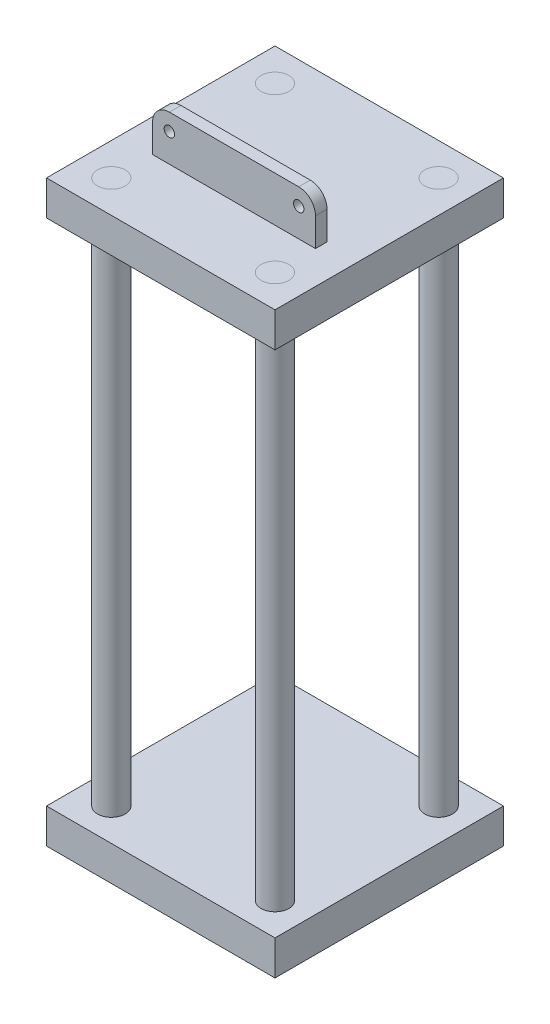
ISO-10303-21;
HEADER;
FILE_DESCRIPTION(('STEP AP214'),'2;1');
FILE_NAME('part.step','',(''),(''),'','','');
FILE_SCHEMA(('AUTOMOTIVE_DESIGN { 1 0 10303 214 1 1 1 1 }'));
ENDSEC;
DATA;
#1=APPLICATION_CONTEXT('core data for automotive mechanical design processes');
#2=APPLICATION_PROTOCOL_DEFINITION('international standard','automotive_design',2000,#1);
#3=PRODUCT_CONTEXT('',#1,'mechanical');
#4=PRODUCT('Part','Part','',(#3));
#5=PRODUCT_RELATED_PRODUCT_CATEGORY('part','',(#4));
#6=PRODUCT_DEFINITION_FORMATION('','',#4);
#7=PRODUCT_DEFINITION_CONTEXT('part definition',#1,'design');
#8=PRODUCT_DEFINITION('design','',#6,#7);
#9=PRODUCT_DEFINITION_SHAPE('','',#8);
#10=(LENGTH_UNIT() NAMED_UNIT(*) SI_UNIT(.MILLI.,.METRE.));
#11=(NAMED_UNIT(*) PLANE_ANGLE_UNIT() SI_UNIT($,.RADIAN.));
#12=(NAMED_UNIT(*) SI_UNIT($,.STERADIAN.) SOLID_ANGLE_UNIT());
#13=UNCERTAINTY_MEASURE_WITH_UNIT(LENGTH_MEASURE(1.E-05),#10,'distance_accuracy_value','');
#14=(GEOMETRIC_REPRESENTATION_CONTEXT(3) GLOBAL_UNCERTAINTY_ASSIGNED_CONTEXT((#13)) GLOBAL_UNIT_ASSIGNED_CONTEXT((#10,
#11,#12)) REPRESENTATION_CONTEXT('',''));
#15=CARTESIAN_POINT('',(0.,0.,0.));
#16=DIRECTION('',(0.,0.,1.));
#17=DIRECTION('',(1.,0.,0.));
#18=AXIS2_PLACEMENT_3D('',#15,#16,#17);
#19=CARTESIAN_POINT('',(27.94,262.25,17.7));
#20=DIRECTION('',(0.,0.,-1.));
#21=DIRECTION('',(-1.,0.,0.));
#22=AXIS2_PLACEMENT_3D('',#19,#20,#21);
#23=CYLINDRICAL_SURFACE('',#22,7.24999999999995);
#24=CARTESIAN_POINT('',(27.94,262.25,12.7));
#25=DIRECTION('',(0.,0.,1.));
#26=DIRECTION('',(1.,0.,0.));
#27=AXIS2_PLACEMENT_3D('',#24,#25,#26);
#28=CIRCLE('',#27,7.24999999999995);
#29=CARTESIAN_POINT('',(27.94,269.5,12.7));
#30=VERTEX_POINT('',#29);
#31=CARTESIAN_POINT('',(35.19,262.25,12.7));
#32=VERTEX_POINT('',#31);
#33=EDGE_CURVE('E141',#30,#32,#28,.F.);
#34=ORIENTED_EDGE('',*,*,#33,.F.);
#35=DIRECTION('',(0.,0.,-1.));
#36=VECTOR('',#35,1.);
#37=CARTESIAN_POINT('',(27.94,269.5,17.7));
#38=LINE('',#37,#36);
#39=CARTESIAN_POINT('',(27.94,269.5,17.7));
#40=VERTEX_POINT('',#39);
#41=EDGE_CURVE('E12',#40,#30,#38,.T.);
#42=ORIENTED_EDGE('',*,*,#41,.F.);
#43=CARTESIAN_POINT('',(27.94,262.25,17.7));
#44=DIRECTION('',(0.,0.,1.));
#45=DIRECTION('',(1.,0.,0.));
#46=AXIS2_PLACEMENT_3D('',#43,#44,#45);
#47=CIRCLE('',#46,7.24999999999995);
#48=CARTESIAN_POINT('',(35.19,262.25,17.7));
#49=VERTEX_POINT('',#48);
#50=EDGE_CURVE('E160',#40,#49,#47,.F.);
#51=ORIENTED_EDGE('',*,*,#50,.T.);
#52=DIRECTION('',(0.,0.,-1.));
#53=VECTOR('',#52,1.);
#54=CARTESIAN_POINT('',(35.19,262.25,17.7));
#55=LINE('',#54,#53);
#56=EDGE_CURVE('E96',#49,#32,#55,.T.);
#57=ORIENTED_EDGE('',*,*,#56,.T.);
#58=EDGE_LOOP('',(#34,#42,#51,#57));
#59=FACE_BOUND('',#58,.T.);
#60=ADVANCED_FACE('F52',(#59),#23,.T.);
#61=CARTESIAN_POINT('',(0.,269.5,17.7));
#62=DIRECTION('',(0.,1.,0.));
#63=DIRECTION('',(0.,0.,1.));
#64=AXIS2_PLACEMENT_3D('',#61,#62,#63);
#65=PLANE('',#64);
#66=DIRECTION('',(1.,0.,0.));
#67=VECTOR('',#66,1.);
#68=CARTESIAN_POINT('',(0.,269.5,12.7));
#69=LINE('',#68,#67);
#70=CARTESIAN_POINT('',(-27.94,269.5,12.7));
#71=VERTEX_POINT('',#70);
#72=EDGE_CURVE('E144',#71,#30,#69,.T.);
#73=ORIENTED_EDGE('',*,*,#72,.F.);
#74=DIRECTION('',(0.,0.,-1.));
#75=VECTOR('',#74,1.);
#76=CARTESIAN_POINT('',(-27.94,269.5,17.7));
#77=LINE('',#76,#75);
#78=CARTESIAN_POINT('',(-27.94,269.5,17.7));
#79=VERTEX_POINT('',#78);
#80=EDGE_CURVE('E60',#79,#71,#77,.T.);
#81=ORIENTED_EDGE('',*,*,#80,.F.);
#82=DIRECTION('',(1.,0.,0.));
#83=VECTOR('',#82,1.);
#84=CARTESIAN_POINT('',(0.,269.5,17.7));
#85=LINE('',#84,#83);
#86=EDGE_CURVE('E130',#79,#40,#85,.T.);
#87=ORIENTED_EDGE('',*,*,#86,.T.);
#88=ORIENTED_EDGE('',*,*,#41,.T.);
#89=EDGE_LOOP('',(#73,#81,#87,#88));
#90=FACE_BOUND('',#89,.T.);
#91=ADVANCED_FACE('F169',(#90),#65,.T.);
#92=CARTESIAN_POINT('',(-27.94,262.25,17.7));
#93=DIRECTION('',(0.,0.,-1.));
#94=DIRECTION('',(-1.,0.,0.));
#95=AXIS2_PLACEMENT_3D('',#92,#93,#94);
#96=CYLINDRICAL_SURFACE('',#95,7.24999999999999);
#97=CARTESIAN_POINT('',(-27.94,262.25,12.7));
#98=DIRECTION('',(0.,0.,1.));
#99=DIRECTION('',(1.,0.,0.));
#100=AXIS2_PLACEMENT_3D('',#97,#98,#99);
#101=CIRCLE('',#100,7.24999999999999);
#102=CARTESIAN_POINT('',(-35.19,262.25,12.7));
#103=VERTEX_POINT('',#102);
#104=EDGE_CURVE('E147',#103,#71,#101,.F.);
#105=ORIENTED_EDGE('',*,*,#104,.F.);
#106=DIRECTION('',(0.,0.,-1.));
#107=VECTOR('',#106,1.);
#108=CARTESIAN_POINT('',(-35.19,262.25,17.7));
#109=LINE('',#108,#107);
#110=CARTESIAN_POINT('',(-35.19,262.25,17.7));
#111=VERTEX_POINT('',#110);
#112=EDGE_CURVE('E117',#111,#103,#109,.T.);
#113=ORIENTED_EDGE('',*,*,#112,.F.);
#114=CARTESIAN_POINT('',(-27.94,262.25,17.7));
#115=DIRECTION('',(0.,0.,1.));
#116=DIRECTION('',(1.,0.,0.));
#117=AXIS2_PLACEMENT_3D('',#114,#115,#116);
#118=CIRCLE('',#117,7.24999999999999);
#119=EDGE_CURVE('E128',#111,#79,#118,.F.);
#120=ORIENTED_EDGE('',*,*,#119,.T.);
#121=ORIENTED_EDGE('',*,*,#80,.T.);
#122=EDGE_LOOP('',(#105,#113,#120,#121));
#123=FACE_BOUND('',#122,.T.);
#124=ADVANCED_FACE('F166',(#123),#96,.T.);
#125=CARTESIAN_POINT('',(-35.1900000000007,0.,17.7));
#126=DIRECTION('',(-1.,0.,0.));
#127=DIRECTION('',(0.,-1.,0.));
#128=AXIS2_PLACEMENT_3D('',#125,#126,#127);
#129=PLANE('',#128);
#130=DIRECTION('',(0.,1.,0.));
#131=VECTOR('',#130,1.);
#132=CARTESIAN_POINT('',(-35.1900000000007,0.,12.7));
#133=LINE('',#132,#131);
#134=CARTESIAN_POINT('',(-35.19,250.,12.7));
#135=VERTEX_POINT('',#134);
#136=EDGE_CURVE('E116',#135,#103,#133,.T.);
#137=ORIENTED_EDGE('',*,*,#136,.F.);
#138=DIRECTION('',(0.,0.,-1.));
#139=VECTOR('',#138,1.);
#140=CARTESIAN_POINT('',(-35.19,250.,17.7));
#141=LINE('',#140,#139);
#142=CARTESIAN_POINT('',(-35.19,250.,17.7));
#143=VERTEX_POINT('',#142);
#144=EDGE_CURVE('E110',#143,#135,#141,.T.);
#145=ORIENTED_EDGE('',*,*,#144,.F.);
#146=DIRECTION('',(0.,1.,0.));
#147=VECTOR('',#146,1.);
#148=CARTESIAN_POINT('',(-35.1900000000007,0.,17.7));
#149=LINE('',#148,#147);
#150=EDGE_CURVE('E114',#143,#111,#149,.T.);
#151=ORIENTED_EDGE('',*,*,#150,.T.);
#152=ORIENTED_EDGE('',*,*,#112,.T.);
#153=EDGE_LOOP('',(#137,#145,#151,#152));
#154=FACE_BOUND('',#153,.T.);
#155=ADVANCED_FACE('F112',(#154),#129,.T.);
#156=CARTESIAN_POINT('',(0.,250.,17.7));
#157=DIRECTION('',(0.,1.,0.));
#158=DIRECTION('',(0.,0.,1.));
#159=AXIS2_PLACEMENT_3D('',#156,#157,#158);
#160=PLANE('',#159);
#161=DIRECTION('',(1.,0.,0.));
#162=VECTOR('',#161,1.);
#163=CARTESIAN_POINT('',(0.,250.,12.7));
#164=LINE('',#163,#162);
#165=CARTESIAN_POINT('',(35.19,250.,12.7));
#166=VERTEX_POINT('',#165);
#167=EDGE_CURVE('E89',#135,#166,#164,.T.);
#168=ORIENTED_EDGE('',*,*,#167,.T.);
#169=DIRECTION('',(0.,0.,-1.));
#170=VECTOR('',#169,1.);
#171=CARTESIAN_POINT('',(35.19,250.,17.7));
#172=LINE('',#171,#170);
#173=CARTESIAN_POINT('',(35.19,250.,17.7));
#174=VERTEX_POINT('',#173);
#175=EDGE_CURVE('E118',#174,#166,#172,.T.);
#176=ORIENTED_EDGE('',*,*,#175,.F.);
#177=DIRECTION('',(1.,0.,0.));
#178=VECTOR('',#177,1.);
#179=CARTESIAN_POINT('',(0.,250.,17.7));
#180=LINE('',#179,#178);
#181=EDGE_CURVE('E120',#143,#174,#180,.T.);
#182=ORIENTED_EDGE('',*,*,#181,.F.);
#183=ORIENTED_EDGE('',*,*,#144,.T.);
#184=EDGE_LOOP('',(#168,#176,#182,#183));
#185=FACE_BOUND('',#184,.T.);
#186=ADVANCED_FACE('F121',(#185),#160,.F.);
#187=CARTESIAN_POINT('',(27.94,262.25,17.7));
#188=DIRECTION('',(0.,0.,-1.));
#189=DIRECTION('',(-1.,0.,0.));
#190=AXIS2_PLACEMENT_3D('',#187,#188,#189);
#191=CYLINDRICAL_SURFACE('',#190,2.25);
#192=CARTESIAN_POINT('',(27.94,262.25,17.7));
#193=DIRECTION('',(0.,0.,1.));
#194=DIRECTION('',(1.,0.,0.));
#195=AXIS2_PLACEMENT_3D('',#192,#193,#194);
#196=CIRCLE('',#195,2.25);
#197=CARTESIAN_POINT('',(30.19,262.25,17.7));
#198=VERTEX_POINT('',#197);
#199=EDGE_CURVE('E135',#198,#198,#196,.T.);
#200=ORIENTED_EDGE('',*,*,#199,.T.);
#201=EDGE_LOOP('',(#200));
#202=FACE_BOUND('',#201,.T.);
#203=CARTESIAN_POINT('',(27.94,262.25,12.7));
#204=DIRECTION('',(0.,0.,1.));
#205=DIRECTION('',(1.,0.,0.));
#206=AXIS2_PLACEMENT_3D('',#203,#204,#205);
#207=CIRCLE('',#206,2.25);
#208=CARTESIAN_POINT('',(30.19,262.25,12.7));
#209=VERTEX_POINT('',#208);
#210=EDGE_CURVE('E154',#209,#209,#207,.T.);
#211=ORIENTED_EDGE('',*,*,#210,.F.);
#212=EDGE_LOOP('',(#211));
#213=FACE_BOUND('',#212,.T.);
#214=ADVANCED_FACE('F190',(#202,#213),#191,.F.);
#215=CARTESIAN_POINT('',(35.1900000000007,0.,17.7));
#216=DIRECTION('',(-1.,0.,0.));
#217=DIRECTION('',(0.,-1.,0.));
#218=AXIS2_PLACEMENT_3D('',#215,#216,#217);
#219=PLANE('',#218);
#220=DIRECTION('',(0.,1.,0.));
#221=VECTOR('',#220,1.);
#222=CARTESIAN_POINT('',(35.1900000000007,0.,12.7));
#223=LINE('',#222,#221);
#224=EDGE_CURVE('E152',#166,#32,#223,.T.);
#225=ORIENTED_EDGE('',*,*,#224,.T.);
#226=ORIENTED_EDGE('',*,*,#56,.F.);
#227=DIRECTION('',(0.,1.,0.));
#228=VECTOR('',#227,1.);
#229=CARTESIAN_POINT('',(35.1900000000007,0.,17.7));
#230=LINE('',#229,#228);
#231=EDGE_CURVE('E68',#174,#49,#230,.T.);
#232=ORIENTED_EDGE('',*,*,#231,.F.);
#233=ORIENTED_EDGE('',*,*,#175,.T.);
#234=EDGE_LOOP('',(#225,#226,#232,#233));
#235=FACE_BOUND('',#234,.T.);
#236=ADVANCED_FACE('F175',(#235),#219,.F.);
#237=CARTESIAN_POINT('',(-27.94,262.25,17.7));
#238=DIRECTION('',(0.,0.,-1.));
#239=DIRECTION('',(-1.,0.,0.));
#240=AXIS2_PLACEMENT_3D('',#237,#238,#239);
#241=CYLINDRICAL_SURFACE('',#240,2.24999999999999);
#242=CARTESIAN_POINT('',(-27.94,262.25,17.7));
#243=DIRECTION('',(0.,0.,1.));
#244=DIRECTION('',(1.,0.,0.));
#245=AXIS2_PLACEMENT_3D('',#242,#243,#244);
#246=CIRCLE('',#245,2.24999999999999);
#247=CARTESIAN_POINT('',(-25.69,262.25,17.7));
#248=VERTEX_POINT('',#247);
#249=EDGE_CURVE('E138',#248,#248,#246,.T.);
#250=ORIENTED_EDGE('',*,*,#249,.T.);
#251=EDGE_LOOP('',(#250));
#252=FACE_BOUND('',#251,.T.);
#253=CARTESIAN_POINT('',(-27.94,262.25,12.7));
#254=DIRECTION('',(0.,0.,1.));
#255=DIRECTION('',(1.,0.,0.));
#256=AXIS2_PLACEMENT_3D('',#253,#254,#255);
#257=CIRCLE('',#256,2.24999999999999);
#258=CARTESIAN_POINT('',(-25.69,262.25,12.7));
#259=VERTEX_POINT('',#258);
#260=EDGE_CURVE('E157',#259,#259,#257,.T.);
#261=ORIENTED_EDGE('',*,*,#260,.F.);
#262=EDGE_LOOP('',(#261));
#263=FACE_BOUND('',#262,.T.);
#264=ADVANCED_FACE('F193',(#252,#263),#241,.F.);
#265=CARTESIAN_POINT('',(0.,0.,17.7));
#266=DIRECTION('',(0.,0.,1.));
#267=DIRECTION('',(1.,0.,0.));
#268=AXIS2_PLACEMENT_3D('',#265,#266,#267);
#269=PLANE('',#268);
#270=ORIENTED_EDGE('',*,*,#50,.F.);
#271=ORIENTED_EDGE('',*,*,#86,.F.);
#272=ORIENTED_EDGE('',*,*,#119,.F.);
#273=ORIENTED_EDGE('',*,*,#150,.F.);
#274=ORIENTED_EDGE('',*,*,#181,.T.);
#275=ORIENTED_EDGE('',*,*,#231,.T.);
#276=EDGE_LOOP('',(#270,#271,#272,#273,#274,#275));
#277=FACE_BOUND('',#276,.T.);
#278=ORIENTED_EDGE('',*,*,#199,.F.);
#279=EDGE_LOOP('',(#278));
#280=FACE_BOUND('',#279,.T.);
#281=ORIENTED_EDGE('',*,*,#249,.F.);
#282=EDGE_LOOP('',(#281));
#283=FACE_BOUND('',#282,.T.);
#284=ADVANCED_FACE('F124',(#277,#280,#283),#269,.T.);
#285=CARTESIAN_POINT('',(0.,0.,12.7));
#286=DIRECTION('',(0.,0.,1.));
#287=DIRECTION('',(1.,0.,0.));
#288=AXIS2_PLACEMENT_3D('',#285,#286,#287);
#289=PLANE('',#288);
#290=ORIENTED_EDGE('',*,*,#33,.T.);
#291=ORIENTED_EDGE('',*,*,#224,.F.);
#292=ORIENTED_EDGE('',*,*,#167,.F.);
#293=ORIENTED_EDGE('',*,*,#136,.T.);
#294=ORIENTED_EDGE('',*,*,#104,.T.);
#295=ORIENTED_EDGE('',*,*,#72,.T.);
#296=EDGE_LOOP('',(#290,#291,#292,#293,#294,#295));
#297=FACE_BOUND('',#296,.T.);
#298=ORIENTED_EDGE('',*,*,#210,.T.);
#299=EDGE_LOOP('',(#298));
#300=FACE_BOUND('',#299,.T.);
#301=ORIENTED_EDGE('',*,*,#260,.T.);
#302=EDGE_LOOP('',(#301));
#303=FACE_BOUND('',#302,.T.);
#304=ADVANCED_FACE('F171',(#297,#300,#303),#289,.F.);
#305=CLOSED_SHELL('',(#60,#91,#124,#155,#186,#214,#236,#264,#284,#304));
#306=MANIFOLD_SOLID_BREP('B2',#305);
#307=CARTESIAN_POINT('',(49.3553390593274,235.,0.));
#308=DIRECTION('',(1.,0.,0.));
#309=DIRECTION('',(0.,0.,-1.));
#310=AXIS2_PLACEMENT_3D('',#307,#308,#309);
#311=PLANE('',#310);
#312=DIRECTION('',(0.,0.,1.));
#313=VECTOR('',#312,1.);
#314=CARTESIAN_POINT('',(49.3553390593274,250.,0.));
#315=LINE('',#314,#313);
#316=CARTESIAN_POINT('',(49.3553390593274,250.,-49.3553390593274));
#317=VERTEX_POINT('',#316);
#318=CARTESIAN_POINT('',(49.3553390593274,250.,49.3553390593274));
#319=VERTEX_POINT('',#318);
#320=EDGE_CURVE('E362',#317,#319,#315,.T.);
#321=ORIENTED_EDGE('',*,*,#320,.T.);
#322=DIRECTION('',(0.,1.,0.));
#323=VECTOR('',#322,1.);
#324=CARTESIAN_POINT('',(49.3553390593274,235.,49.3553390593274));
#325=LINE('',#324,#323);
#326=CARTESIAN_POINT('',(49.3553390593274,235.,49.3553390593274));
#327=VERTEX_POINT('',#326);
#328=EDGE_CURVE('E349',#327,#319,#325,.T.);
#329=ORIENTED_EDGE('',*,*,#328,.F.);
#330=DIRECTION('',(0.,0.,1.));
#331=VECTOR('',#330,1.);
#332=CARTESIAN_POINT('',(49.3553390593274,235.,0.));
#333=LINE('',#332,#331);
#334=CARTESIAN_POINT('',(49.3553390593274,235.,-49.3553390593274));
#335=VERTEX_POINT('',#334);
#336=EDGE_CURVE('E342',#335,#327,#333,.T.);
#337=ORIENTED_EDGE('',*,*,#336,.F.);
#338=DIRECTION('',(0.,1.,0.));
#339=VECTOR('',#338,1.);
#340=CARTESIAN_POINT('',(49.3553390593274,235.,-49.3553390593274));
#341=LINE('',#340,#339);
#342=EDGE_CURVE('E50',#335,#317,#341,.T.);
#343=ORIENTED_EDGE('',*,*,#342,.T.);
#344=EDGE_LOOP('',(#321,#329,#337,#343));
#345=FACE_BOUND('',#344,.T.);
#346=ADVANCED_FACE('F284',(#345),#311,.T.);
#347=CARTESIAN_POINT('',(0.,235.,-49.3553390593274));
#348=DIRECTION('',(0.,0.,-1.));
#349=DIRECTION('',(-1.,0.,0.));
#350=AXIS2_PLACEMENT_3D('',#347,#348,#349);
#351=PLANE('',#350);
#352=DIRECTION('',(1.,0.,0.));
#353=VECTOR('',#352,1.);
#354=CARTESIAN_POINT('',(0.,250.,-49.3553390593274));
#355=LINE('',#354,#353);
#356=CARTESIAN_POINT('',(-49.3553390593274,250.,-49.3553390593274));
#357=VERTEX_POINT('',#356);
#358=EDGE_CURVE('E365',#357,#317,#355,.T.);
#359=ORIENTED_EDGE('',*,*,#358,.T.);
#360=ORIENTED_EDGE('',*,*,#342,.F.);
#361=DIRECTION('',(1.,0.,0.));
#362=VECTOR('',#361,1.);
#363=CARTESIAN_POINT('',(0.,235.,-49.3553390593274));
#364=LINE('',#363,#362);
#365=CARTESIAN_POINT('',(-49.3553390593274,235.,-49.3553390593274));
#366=VERTEX_POINT('',#365);
#367=EDGE_CURVE('E326',#366,#335,#364,.T.);
#368=ORIENTED_EDGE('',*,*,#367,.F.);
#369=DIRECTION('',(0.,1.,0.));
#370=VECTOR('',#369,1.);
#371=CARTESIAN_POINT('',(-49.3553390593274,235.,-49.3553390593274));
#372=LINE('',#371,#370);
#373=EDGE_CURVE('E293',#366,#357,#372,.T.);
#374=ORIENTED_EDGE('',*,*,#373,.T.);
#375=EDGE_LOOP('',(#359,#360,#368,#374));
#376=FACE_BOUND('',#375,.T.);
#377=ADVANCED_FACE('F340',(#376),#351,.T.);
#378=CARTESIAN_POINT('',(-49.3553390593274,235.,0.));
#379=DIRECTION('',(1.,0.,0.));
#380=DIRECTION('',(0.,0.,-1.));
#381=AXIS2_PLACEMENT_3D('',#378,#379,#380);
#382=PLANE('',#381);
#383=DIRECTION('',(0.,0.,1.));
#384=VECTOR('',#383,1.);
#385=CARTESIAN_POINT('',(-49.3553390593274,250.,0.));
#386=LINE('',#385,#384);
#387=CARTESIAN_POINT('',(-49.3553390593274,250.,49.3553390593274));
#388=VERTEX_POINT('',#387);
#389=EDGE_CURVE('E336',#357,#388,#386,.T.);
#390=ORIENTED_EDGE('',*,*,#389,.F.);
#391=ORIENTED_EDGE('',*,*,#373,.F.);
#392=DIRECTION('',(0.,0.,1.));
#393=VECTOR('',#392,1.);
#394=CARTESIAN_POINT('',(-49.3553390593274,235.,0.));
#395=LINE('',#394,#393);
#396=CARTESIAN_POINT('',(-49.3553390593274,235.,49.3553390593274));
#397=VERTEX_POINT('',#396);
#398=EDGE_CURVE('E329',#366,#397,#395,.T.);
#399=ORIENTED_EDGE('',*,*,#398,.T.);
#400=DIRECTION('',(0.,1.,0.));
#401=VECTOR('',#400,1.);
#402=CARTESIAN_POINT('',(-49.3553390593274,235.,49.3553390593274));
#403=LINE('',#402,#401);
#404=EDGE_CURVE('E339',#397,#388,#403,.T.);
#405=ORIENTED_EDGE('',*,*,#404,.T.);
#406=EDGE_LOOP('',(#390,#391,#399,#405));
#407=FACE_BOUND('',#406,.T.);
#408=ADVANCED_FACE('F335',(#407),#382,.F.);
#409=CARTESIAN_POINT('',(-35.3553390593274,235.,-35.3553390593274));
#410=DIRECTION('',(0.,1.,0.));
#411=DIRECTION('',(0.,0.,-1.));
#412=AXIS2_PLACEMENT_3D('',#409,#410,#411);
#413=CYLINDRICAL_SURFACE('',#412,5.99999999999999);
#414=CARTESIAN_POINT('',(-35.3553390593274,235.,-35.3553390593274));
#415=DIRECTION('',(0.,1.,0.));
#416=DIRECTION('',(0.,0.,1.));
#417=AXIS2_PLACEMENT_3D('',#414,#415,#416);
#418=CIRCLE('',#417,5.99999999999999);
#419=CARTESIAN_POINT('',(-35.3553390593274,235.,-29.3553390593274));
#420=VERTEX_POINT('',#419);
#421=EDGE_CURVE('E344',#420,#420,#418,.T.);
#422=ORIENTED_EDGE('',*,*,#421,.F.);
#423=EDGE_LOOP('',(#422));
#424=FACE_BOUND('',#423,.T.);
#425=CARTESIAN_POINT('',(-35.3553390593274,250.,-35.3553390593274));
#426=DIRECTION('',(0.,1.,0.));
#427=DIRECTION('',(0.,0.,1.));
#428=AXIS2_PLACEMENT_3D('',#425,#426,#427);
#429=CIRCLE('',#428,5.99999999999999);
#430=CARTESIAN_POINT('',(-35.3553390593274,250.,-29.3553390593274));
#431=VERTEX_POINT('',#430);
#432=EDGE_CURVE('E359',#431,#431,#429,.T.);
#433=ORIENTED_EDGE('',*,*,#432,.T.);
#434=EDGE_LOOP('',(#433));
#435=FACE_BOUND('',#434,.T.);
#436=ADVANCED_FACE('F394',(#424,#435),#413,.F.);
#437=CARTESIAN_POINT('',(35.3553390593274,235.,-35.3553390593274));
#438=DIRECTION('',(0.,1.,0.));
#439=DIRECTION('',(0.,0.,-1.));
#440=AXIS2_PLACEMENT_3D('',#437,#438,#439);
#441=CYLINDRICAL_SURFACE('',#440,5.99999999999999);
#442=CARTESIAN_POINT('',(35.3553390593274,235.,-35.3553390593274));
#443=DIRECTION('',(0.,1.,0.));
#444=DIRECTION('',(0.,0.,1.));
#445=AXIS2_PLACEMENT_3D('',#442,#443,#444);
#446=CIRCLE('',#445,5.99999999999999);
#447=CARTESIAN_POINT('',(35.3553390593274,235.,-29.3553390593274));
#448=VERTEX_POINT('',#447);
#449=EDGE_CURVE('E477',#448,#448,#446,.T.);
#450=ORIENTED_EDGE('',*,*,#449,.F.);
#451=EDGE_LOOP('',(#450));
#452=FACE_BOUND('',#451,.T.);
#453=CARTESIAN_POINT('',(35.3553390593274,250.,-35.3553390593274));
#454=DIRECTION('',(0.,1.,0.));
#455=DIRECTION('',(0.,0.,1.));
#456=AXIS2_PLACEMENT_3D('',#453,#454,#455);
#457=CIRCLE('',#456,5.99999999999999);
#458=CARTESIAN_POINT('',(35.3553390593274,250.,-29.3553390593274));
#459=VERTEX_POINT('',#458);
#460=EDGE_CURVE('E356',#459,#459,#457,.T.);
#461=ORIENTED_EDGE('',*,*,#460,.T.);
#462=EDGE_LOOP('',(#461));
#463=FACE_BOUND('',#462,.T.);
#464=ADVANCED_FACE('F397',(#452,#463),#441,.F.);
#465=CARTESIAN_POINT('',(35.3553390593274,235.,35.3553390593274));
#466=DIRECTION('',(0.,1.,0.));
#467=DIRECTION('',(0.,0.,-1.));
#468=AXIS2_PLACEMENT_3D('',#465,#466,#467);
#469=CYLINDRICAL_SURFACE('',#468,5.99999999999999);
#470=CARTESIAN_POINT('',(35.3553390593274,235.,35.3553390593274));
#471=DIRECTION('',(0.,1.,0.));
#472=DIRECTION('',(0.,0.,1.));
#473=AXIS2_PLACEMENT_3D('',#470,#471,#472);
#474=CIRCLE('',#473,5.99999999999999);
#475=CARTESIAN_POINT('',(35.3553390593274,235.,41.3553390593274));
#476=VERTEX_POINT('',#475);
#477=EDGE_CURVE('E408',#476,#476,#474,.T.);
#478=ORIENTED_EDGE('',*,*,#477,.F.);
#479=EDGE_LOOP('',(#478));
#480=FACE_BOUND('',#479,.T.);
#481=CARTESIAN_POINT('',(35.3553390593274,250.,35.3553390593274));
#482=DIRECTION('',(0.,1.,0.));
#483=DIRECTION('',(0.,0.,1.));
#484=AXIS2_PLACEMENT_3D('',#481,#482,#483);
#485=CIRCLE('',#484,5.99999999999999);
#486=CARTESIAN_POINT('',(35.3553390593274,250.,41.3553390593274));
#487=VERTEX_POINT('',#486);
#488=EDGE_CURVE('E353',#487,#487,#485,.T.);
#489=ORIENTED_EDGE('',*,*,#488,.T.);
#490=EDGE_LOOP('',(#489));
#491=FACE_BOUND('',#490,.T.);
#492=ADVANCED_FACE('F383',(#480,#491),#469,.F.);
#493=CARTESIAN_POINT('',(-35.3553390593274,235.,35.3553390593274));
#494=DIRECTION('',(0.,1.,0.));
#495=DIRECTION('',(0.,0.,-1.));
#496=AXIS2_PLACEMENT_3D('',#493,#494,#495);
#497=CYLINDRICAL_SURFACE('',#496,6.00000000000001);
#498=CARTESIAN_POINT('',(-35.3553390593274,235.,35.3553390593274));
#499=DIRECTION('',(0.,1.,0.));
#500=DIRECTION('',(0.,0.,1.));
#501=AXIS2_PLACEMENT_3D('',#498,#499,#500);
#502=CIRCLE('',#501,6.00000000000001);
#503=CARTESIAN_POINT('',(-35.3553390593274,235.,41.3553390593274));
#504=VERTEX_POINT('',#503);
#505=EDGE_CURVE('E369',#504,#504,#502,.T.);
#506=ORIENTED_EDGE('',*,*,#505,.F.);
#507=EDGE_LOOP('',(#506));
#508=FACE_BOUND('',#507,.T.);
#509=CARTESIAN_POINT('',(-35.3553390593274,250.,35.3553390593274));
#510=DIRECTION('',(0.,1.,0.));
#511=DIRECTION('',(0.,0.,1.));
#512=AXIS2_PLACEMENT_3D('',#509,#510,#511);
#513=CIRCLE('',#512,6.00000000000001);
#514=CARTESIAN_POINT('',(-35.3553390593274,250.,41.3553390593274));
#515=VERTEX_POINT('',#514);
#516=EDGE_CURVE('E350',#515,#515,#513,.T.);
#517=ORIENTED_EDGE('',*,*,#516,.T.);
#518=EDGE_LOOP('',(#517));
#519=FACE_BOUND('',#518,.T.);
#520=ADVANCED_FACE('F286',(#508,#519),#497,.F.);
#521=CARTESIAN_POINT('',(0.,235.,49.3553390593274));
#522=DIRECTION('',(0.,0.,-1.));
#523=DIRECTION('',(-1.,0.,0.));
#524=AXIS2_PLACEMENT_3D('',#521,#522,#523);
#525=PLANE('',#524);
#526=DIRECTION('',(1.,0.,0.));
#527=VECTOR('',#526,1.);
#528=CARTESIAN_POINT('',(0.,250.,49.3553390593274));
#529=LINE('',#528,#527);
#530=EDGE_CURVE('E315',#388,#319,#529,.T.);
#531=ORIENTED_EDGE('',*,*,#530,.F.);
#532=ORIENTED_EDGE('',*,*,#404,.F.);
#533=DIRECTION('',(1.,0.,0.));
#534=VECTOR('',#533,1.);
#535=CARTESIAN_POINT('',(0.,235.,49.3553390593274));
#536=LINE('',#535,#534);
#537=EDGE_CURVE('E301',#397,#327,#536,.T.);
#538=ORIENTED_EDGE('',*,*,#537,.T.);
#539=ORIENTED_EDGE('',*,*,#328,.T.);
#540=EDGE_LOOP('',(#531,#532,#538,#539));
#541=FACE_BOUND('',#540,.T.);
#542=ADVANCED_FACE('F374',(#541),#525,.F.);
#543=CARTESIAN_POINT('',(0.,235.,0.));
#544=DIRECTION('',(0.,-1.,0.));
#545=DIRECTION('',(0.,0.,1.));
#546=AXIS2_PLACEMENT_3D('',#543,#544,#545);
#547=PLANE('',#546);
#548=ORIENTED_EDGE('',*,*,#505,.T.);
#549=EDGE_LOOP('',(#548));
#550=FACE_BOUND('',#549,.T.);
#551=ORIENTED_EDGE('',*,*,#477,.T.);
#552=EDGE_LOOP('',(#551));
#553=FACE_BOUND('',#552,.T.);
#554=ORIENTED_EDGE('',*,*,#449,.T.);
#555=EDGE_LOOP('',(#554));
#556=FACE_BOUND('',#555,.T.);
#557=ORIENTED_EDGE('',*,*,#421,.T.);
#558=EDGE_LOOP('',(#557));
#559=FACE_BOUND('',#558,.T.);
#560=ORIENTED_EDGE('',*,*,#336,.T.);
#561=ORIENTED_EDGE('',*,*,#537,.F.);
#562=ORIENTED_EDGE('',*,*,#398,.F.);
#563=ORIENTED_EDGE('',*,*,#367,.T.);
#564=EDGE_LOOP('',(#560,#561,#562,#563));
#565=FACE_BOUND('',#564,.T.);
#566=ADVANCED_FACE('F331',(#550,#553,#556,#559,#565),#547,.T.);
#567=CARTESIAN_POINT('',(0.,250.,0.));
#568=DIRECTION('',(0.,-1.,0.));
#569=DIRECTION('',(0.,0.,1.));
#570=AXIS2_PLACEMENT_3D('',#567,#568,#569);
#571=PLANE('',#570);
#572=ORIENTED_EDGE('',*,*,#516,.F.);
#573=EDGE_LOOP('',(#572));
#574=FACE_BOUND('',#573,.T.);
#575=ORIENTED_EDGE('',*,*,#488,.F.);
#576=EDGE_LOOP('',(#575));
#577=FACE_BOUND('',#576,.T.);
#578=ORIENTED_EDGE('',*,*,#460,.F.);
#579=EDGE_LOOP('',(#578));
#580=FACE_BOUND('',#579,.T.);
#581=ORIENTED_EDGE('',*,*,#432,.F.);
#582=EDGE_LOOP('',(#581));
#583=FACE_BOUND('',#582,.T.);
#584=ORIENTED_EDGE('',*,*,#320,.F.);
#585=ORIENTED_EDGE('',*,*,#358,.F.);
#586=ORIENTED_EDGE('',*,*,#389,.T.);
#587=ORIENTED_EDGE('',*,*,#530,.T.);
#588=EDGE_LOOP('',(#584,#585,#586,#587));
#589=FACE_BOUND('',#588,.T.);
#590=ADVANCED_FACE('F371',(#574,#577,#580,#583,#589),#571,.F.);
#591=CLOSED_SHELL('',(#346,#377,#408,#436,#464,#492,#520,#542,#566,#590));
#592=MANIFOLD_SOLID_BREP('B6',#591);
#593=CARTESIAN_POINT('',(-35.3553390593274,250.,35.3553390593274));
#594=DIRECTION('',(0.,-1.,0.));
#595=DIRECTION('',(0.,0.,-1.));
#596=AXIS2_PLACEMENT_3D('',#593,#594,#595);
#597=CYLINDRICAL_SURFACE('',#596,6.00000000000001);
#598=CARTESIAN_POINT('',(-35.3553390593274,250.,35.3553390593274));
#599=DIRECTION('',(0.,1.,0.));
#600=DIRECTION('',(0.,0.,1.));
#601=AXIS2_PLACEMENT_3D('',#598,#599,#600);
#602=CIRCLE('',#601,6.00000000000001);
#603=CARTESIAN_POINT('',(-35.3553390593274,250.,41.3553390593274));
#604=VERTEX_POINT('',#603);
#605=EDGE_CURVE('E283',#604,#604,#602,.T.);
#606=ORIENTED_EDGE('',*,*,#605,.F.);
#607=EDGE_LOOP('',(#606));
#608=FACE_BOUND('',#607,.T.);
#609=CARTESIAN_POINT('',(-35.3553390593274,0.,35.3553390593274));
#610=DIRECTION('',(0.,1.,0.));
#611=DIRECTION('',(0.,0.,1.));
#612=AXIS2_PLACEMENT_3D('',#609,#610,#611);
#613=CIRCLE('',#612,6.00000000000001);
#614=CARTESIAN_POINT('',(-35.3553390593274,0.,41.3553390593274));
#615=VERTEX_POINT('',#614);
#616=EDGE_CURVE('E503',#615,#615,#613,.T.);
#617=ORIENTED_EDGE('',*,*,#616,.T.);
#618=EDGE_LOOP('',(#617));
#619=FACE_BOUND('',#618,.T.);
#620=ADVANCED_FACE('F500',(#608,#619),#597,.T.);
#621=CARTESIAN_POINT('',(0.,250.,0.));
#622=DIRECTION('',(0.,1.,0.));
#623=DIRECTION('',(0.,0.,1.));
#624=AXIS2_PLACEMENT_3D('',#621,#622,#623);
#625=PLANE('',#624);
#626=ORIENTED_EDGE('',*,*,#605,.T.);
#627=EDGE_LOOP('',(#626));
#628=FACE_BOUND('',#627,.T.);
#629=ADVANCED_FACE('F515',(#628),#625,.T.);
#630=CARTESIAN_POINT('',(0.,0.,0.));
#631=DIRECTION('',(0.,1.,0.));
#632=DIRECTION('',(0.,0.,1.));
#633=AXIS2_PLACEMENT_3D('',#630,#631,#632);
#634=PLANE('',#633);
#635=ORIENTED_EDGE('',*,*,#616,.F.);
#636=EDGE_LOOP('',(#635));
#637=FACE_BOUND('',#636,.T.);
#638=ADVANCED_FACE('F513',(#637),#634,.F.);
#639=CLOSED_SHELL('',(#620,#629,#638));
#640=MANIFOLD_SOLID_BREP('B44',#639);
#641=CARTESIAN_POINT('',(35.3553390593274,250.,35.3553390593274));
#642=DIRECTION('',(0.,-1.,0.));
#643=DIRECTION('',(0.,0.,-1.));
#644=AXIS2_PLACEMENT_3D('',#641,#642,#643);
#645=CYLINDRICAL_SURFACE('',#644,5.99999999999999);
#646=CARTESIAN_POINT('',(35.3553390593274,250.,35.3553390593274));
#647=DIRECTION('',(0.,1.,0.));
#648=DIRECTION('',(0.,0.,1.));
#649=AXIS2_PLACEMENT_3D('',#646,#647,#648);
#650=CIRCLE('',#649,5.99999999999999);
#651=CARTESIAN_POINT('',(35.3553390593274,250.,41.3553390593274));
#652=VERTEX_POINT('',#651);
#653=EDGE_CURVE('E499',#652,#652,#650,.T.);
#654=ORIENTED_EDGE('',*,*,#653,.F.);
#655=EDGE_LOOP('',(#654));
#656=FACE_BOUND('',#655,.T.);
#657=CARTESIAN_POINT('',(35.3553390593274,0.,35.3553390593274));
#658=DIRECTION('',(0.,1.,0.));
#659=DIRECTION('',(0.,0.,1.));
#660=AXIS2_PLACEMENT_3D('',#657,#658,#659);
#661=CIRCLE('',#660,5.99999999999999);
#662=CARTESIAN_POINT('',(35.3553390593274,0.,41.3553390593274));
#663=VERTEX_POINT('',#662);
#664=EDGE_CURVE('E552',#663,#663,#661,.T.);
#665=ORIENTED_EDGE('',*,*,#664,.T.);
#666=EDGE_LOOP('',(#665));
#667=FACE_BOUND('',#666,.T.);
#668=ADVANCED_FACE('F549',(#656,#667),#645,.T.);
#669=CARTESIAN_POINT('',(0.,250.,0.));
#670=DIRECTION('',(0.,1.,0.));
#671=DIRECTION('',(0.,0.,1.));
#672=AXIS2_PLACEMENT_3D('',#669,#670,#671);
#673=PLANE('',#672);
#674=ORIENTED_EDGE('',*,*,#653,.T.);
#675=EDGE_LOOP('',(#674));
#676=FACE_BOUND('',#675,.T.);
#677=ADVANCED_FACE('F564',(#676),#673,.T.);
#678=CARTESIAN_POINT('',(0.,0.,0.));
#679=DIRECTION('',(0.,1.,0.));
#680=DIRECTION('',(0.,0.,1.));
#681=AXIS2_PLACEMENT_3D('',#678,#679,#680);
#682=PLANE('',#681);
#683=ORIENTED_EDGE('',*,*,#664,.F.);
#684=EDGE_LOOP('',(#683));
#685=FACE_BOUND('',#684,.T.);
#686=ADVANCED_FACE('F562',(#685),#682,.F.);
#687=CLOSED_SHELL('',(#668,#677,#686));
#688=MANIFOLD_SOLID_BREP('B278',#687);
#689=CARTESIAN_POINT('',(35.3553390593274,250.,-35.3553390593274));
#690=DIRECTION('',(0.,-1.,0.));
#691=DIRECTION('',(0.,0.,-1.));
#692=AXIS2_PLACEMENT_3D('',#689,#690,#691);
#693=CYLINDRICAL_SURFACE('',#692,5.99999999999999);
#694=CARTESIAN_POINT('',(35.3553390593274,250.,-35.3553390593274));
#695=DIRECTION('',(0.,1.,0.));
#696=DIRECTION('',(0.,0.,1.));
#697=AXIS2_PLACEMENT_3D('',#694,#695,#696);
#698=CIRCLE('',#697,5.99999999999999);
#699=CARTESIAN_POINT('',(35.3553390593274,250.,-29.3553390593274));
#700=VERTEX_POINT('',#699);
#701=EDGE_CURVE('E548',#700,#700,#698,.T.);
#702=ORIENTED_EDGE('',*,*,#701,.F.);
#703=EDGE_LOOP('',(#702));
#704=FACE_BOUND('',#703,.T.);
#705=CARTESIAN_POINT('',(35.3553390593274,0.,-35.3553390593274));
#706=DIRECTION('',(0.,1.,0.));
#707=DIRECTION('',(0.,0.,1.));
#708=AXIS2_PLACEMENT_3D('',#705,#706,#707);
#709=CIRCLE('',#708,5.99999999999999);
#710=CARTESIAN_POINT('',(35.3553390593274,0.,-29.3553390593274));
#711=VERTEX_POINT('',#710);
#712=EDGE_CURVE('E601',#711,#711,#709,.T.);
#713=ORIENTED_EDGE('',*,*,#712,.T.);
#714=EDGE_LOOP('',(#713));
#715=FACE_BOUND('',#714,.T.);
#716=ADVANCED_FACE('F598',(#704,#715),#693,.T.);
#717=CARTESIAN_POINT('',(0.,250.,0.));
#718=DIRECTION('',(0.,1.,0.));
#719=DIRECTION('',(0.,0.,1.));
#720=AXIS2_PLACEMENT_3D('',#717,#718,#719);
#721=PLANE('',#720);
#722=ORIENTED_EDGE('',*,*,#701,.T.);
#723=EDGE_LOOP('',(#722));
#724=FACE_BOUND('',#723,.T.);
#725=ADVANCED_FACE('F613',(#724),#721,.T.);
#726=CARTESIAN_POINT('',(0.,0.,0.));
#727=DIRECTION('',(0.,1.,0.));
#728=DIRECTION('',(0.,0.,1.));
#729=AXIS2_PLACEMENT_3D('',#726,#727,#728);
#730=PLANE('',#729);
#731=ORIENTED_EDGE('',*,*,#712,.F.);
#732=EDGE_LOOP('',(#731));
#733=FACE_BOUND('',#732,.T.);
#734=ADVANCED_FACE('F611',(#733),#730,.F.);
#735=CLOSED_SHELL('',(#716,#725,#734));
#736=MANIFOLD_SOLID_BREP('B494',#735);
#737=CARTESIAN_POINT('',(-35.3553390593274,250.,-35.3553390593274));
#738=DIRECTION('',(0.,-1.,0.));
#739=DIRECTION('',(0.,0.,-1.));
#740=AXIS2_PLACEMENT_3D('',#737,#738,#739);
#741=CYLINDRICAL_SURFACE('',#740,5.99999999999999);
#742=CARTESIAN_POINT('',(-35.3553390593274,250.,-35.3553390593274));
#743=DIRECTION('',(0.,1.,0.));
#744=DIRECTION('',(0.,0.,1.));
#745=AXIS2_PLACEMENT_3D('',#742,#743,#744);
#746=CIRCLE('',#745,5.99999999999999);
#747=CARTESIAN_POINT('',(-35.3553390593274,250.,-29.3553390593274));
#748=VERTEX_POINT('',#747);
#749=EDGE_CURVE('E597',#748,#748,#746,.T.);
#750=ORIENTED_EDGE('',*,*,#749,.F.);
#751=EDGE_LOOP('',(#750));
#752=FACE_BOUND('',#751,.T.);
#753=CARTESIAN_POINT('',(-35.3553390593274,0.,-35.3553390593274));
#754=DIRECTION('',(0.,1.,0.));
#755=DIRECTION('',(0.,0.,1.));
#756=AXIS2_PLACEMENT_3D('',#753,#754,#755);
#757=CIRCLE('',#756,5.99999999999999);
#758=CARTESIAN_POINT('',(-35.3553390593274,0.,-29.3553390593274));
#759=VERTEX_POINT('',#758);
#760=EDGE_CURVE('E651',#759,#759,#757,.T.);
#761=ORIENTED_EDGE('',*,*,#760,.T.);
#762=EDGE_LOOP('',(#761));
#763=FACE_BOUND('',#762,.T.);
#764=ADVANCED_FACE('F648',(#752,#763),#741,.T.);
#765=CARTESIAN_POINT('',(0.,250.,0.));
#766=DIRECTION('',(0.,1.,0.));
#767=DIRECTION('',(0.,0.,1.));
#768=AXIS2_PLACEMENT_3D('',#765,#766,#767);
#769=PLANE('',#768);
#770=ORIENTED_EDGE('',*,*,#749,.T.);
#771=EDGE_LOOP('',(#770));
#772=FACE_BOUND('',#771,.T.);
#773=ADVANCED_FACE('F663',(#772),#769,.T.);
#774=CARTESIAN_POINT('',(0.,0.,0.));
#775=DIRECTION('',(0.,1.,0.));
#776=DIRECTION('',(0.,0.,1.));
#777=AXIS2_PLACEMENT_3D('',#774,#775,#776);
#778=PLANE('',#777);
#779=ORIENTED_EDGE('',*,*,#760,.F.);
#780=EDGE_LOOP('',(#779));
#781=FACE_BOUND('',#780,.T.);
#782=ADVANCED_FACE('F661',(#781),#778,.F.);
#783=CLOSED_SHELL('',(#764,#773,#782));
#784=MANIFOLD_SOLID_BREP('B543',#783);
#785=CARTESIAN_POINT('',(49.3553390593274,15.,0.));
#786=DIRECTION('',(1.,0.,0.));
#787=DIRECTION('',(0.,0.,-1.));
#788=AXIS2_PLACEMENT_3D('',#785,#786,#787);
#789=PLANE('',#788);
#790=DIRECTION('',(0.,0.,1.));
#791=VECTOR('',#790,1.);
#792=CARTESIAN_POINT('',(49.3553390593274,0.,0.));
#793=LINE('',#792,#791);
#794=CARTESIAN_POINT('',(49.3553390593274,0.,-49.3553390593274));
#795=VERTEX_POINT('',#794);
#796=CARTESIAN_POINT('',(49.3553390593274,0.,49.3553390593274));
#797=VERTEX_POINT('',#796);
#798=EDGE_CURVE('E769',#795,#797,#793,.T.);
#799=ORIENTED_EDGE('',*,*,#798,.F.);
#800=DIRECTION('',(0.,-1.,0.));
#801=VECTOR('',#800,1.);
#802=CARTESIAN_POINT('',(49.3553390593274,15.,-49.3553390593274));
#803=LINE('',#802,#801);
#804=CARTESIAN_POINT('',(49.3553390593274,15.,-49.3553390593274));
#805=VERTEX_POINT('',#804);
#806=EDGE_CURVE('E646',#805,#795,#803,.T.);
#807=ORIENTED_EDGE('',*,*,#806,.F.);
#808=DIRECTION('',(0.,0.,1.));
#809=VECTOR('',#808,1.);
#810=CARTESIAN_POINT('',(49.3553390593274,15.,0.));
#811=LINE('',#810,#809);
#812=CARTESIAN_POINT('',(49.3553390593274,15.,49.3553390593274));
#813=VERTEX_POINT('',#812);
#814=EDGE_CURVE('E750',#805,#813,#811,.T.);
#815=ORIENTED_EDGE('',*,*,#814,.T.);
#816=DIRECTION('',(0.,-1.,0.));
#817=VECTOR('',#816,1.);
#818=CARTESIAN_POINT('',(49.3553390593274,15.,49.3553390593274));
#819=LINE('',#818,#817);
#820=EDGE_CURVE('E729',#813,#797,#819,.T.);
#821=ORIENTED_EDGE('',*,*,#820,.T.);
#822=EDGE_LOOP('',(#799,#807,#815,#821));
#823=FACE_BOUND('',#822,.T.);
#824=ADVANCED_FACE('F689',(#823),#789,.T.);
#825=CARTESIAN_POINT('',(0.,15.,-49.3553390593274));
#826=DIRECTION('',(0.,0.,-1.));
#827=DIRECTION('',(-1.,0.,0.));
#828=AXIS2_PLACEMENT_3D('',#825,#826,#827);
#829=PLANE('',#828);
#830=DIRECTION('',(1.,0.,0.));
#831=VECTOR('',#830,1.);
#832=CARTESIAN_POINT('',(0.,0.,-49.3553390593274));
#833=LINE('',#832,#831);
#834=CARTESIAN_POINT('',(-49.3553390593274,0.,-49.3553390593274));
#835=VERTEX_POINT('',#834);
#836=EDGE_CURVE('E741',#835,#795,#833,.T.);
#837=ORIENTED_EDGE('',*,*,#836,.F.);
#838=DIRECTION('',(0.,-1.,0.));
#839=VECTOR('',#838,1.);
#840=CARTESIAN_POINT('',(-49.3553390593274,15.,-49.3553390593274));
#841=LINE('',#840,#839);
#842=CARTESIAN_POINT('',(-49.3553390593274,15.,-49.3553390593274));
#843=VERTEX_POINT('',#842);
#844=EDGE_CURVE('E698',#843,#835,#841,.T.);
#845=ORIENTED_EDGE('',*,*,#844,.F.);
#846=DIRECTION('',(1.,0.,0.));
#847=VECTOR('',#846,1.);
#848=CARTESIAN_POINT('',(0.,15.,-49.3553390593274));
#849=LINE('',#848,#847);
#850=EDGE_CURVE('E739',#843,#805,#849,.T.);
#851=ORIENTED_EDGE('',*,*,#850,.T.);
#852=ORIENTED_EDGE('',*,*,#806,.T.);
#853=EDGE_LOOP('',(#837,#845,#851,#852));
#854=FACE_BOUND('',#853,.T.);
#855=ADVANCED_FACE('F737',(#854),#829,.T.);
#856=CARTESIAN_POINT('',(-49.3553390593274,15.,0.));
#857=DIRECTION('',(1.,0.,0.));
#858=DIRECTION('',(0.,0.,-1.));
#859=AXIS2_PLACEMENT_3D('',#856,#857,#858);
#860=PLANE('',#859);
#861=DIRECTION('',(0.,0.,1.));
#862=VECTOR('',#861,1.);
#863=CARTESIAN_POINT('',(-49.3553390593274,0.,0.));
#864=LINE('',#863,#862);
#865=CARTESIAN_POINT('',(-49.3553390593274,0.,49.3553390593274));
#866=VERTEX_POINT('',#865);
#867=EDGE_CURVE('E772',#835,#866,#864,.T.);
#868=ORIENTED_EDGE('',*,*,#867,.T.);
#869=DIRECTION('',(0.,-1.,0.));
#870=VECTOR('',#869,1.);
#871=CARTESIAN_POINT('',(-49.3553390593274,15.,49.3553390593274));
#872=LINE('',#871,#870);
#873=CARTESIAN_POINT('',(-49.3553390593274,15.,49.3553390593274));
#874=VERTEX_POINT('',#873);
#875=EDGE_CURVE('E744',#874,#866,#872,.T.);
#876=ORIENTED_EDGE('',*,*,#875,.F.);
#877=DIRECTION('',(0.,0.,1.));
#878=VECTOR('',#877,1.);
#879=CARTESIAN_POINT('',(-49.3553390593274,15.,0.));
#880=LINE('',#879,#878);
#881=EDGE_CURVE('E746',#843,#874,#880,.T.);
#882=ORIENTED_EDGE('',*,*,#881,.F.);
#883=ORIENTED_EDGE('',*,*,#844,.T.);
#884=EDGE_LOOP('',(#868,#876,#882,#883));
#885=FACE_BOUND('',#884,.T.);
#886=ADVANCED_FACE('F747',(#885),#860,.F.);
#887=CARTESIAN_POINT('',(-35.3553390593274,15.,-35.3553390593274));
#888=DIRECTION('',(0.,-1.,0.));
#889=DIRECTION('',(0.,0.,-1.));
#890=AXIS2_PLACEMENT_3D('',#887,#888,#889);
#891=CYLINDRICAL_SURFACE('',#890,5.99999999999999);
#892=CARTESIAN_POINT('',(-35.3553390593274,15.,-35.3553390593274));
#893=DIRECTION('',(0.,1.,0.));
#894=DIRECTION('',(0.,0.,1.));
#895=AXIS2_PLACEMENT_3D('',#892,#893,#894);
#896=CIRCLE('',#895,5.99999999999999);
#897=CARTESIAN_POINT('',(-35.3553390593274,15.,-29.3553390593274));
#898=VERTEX_POINT('',#897);
#899=EDGE_CURVE('E752',#898,#898,#896,.T.);
#900=ORIENTED_EDGE('',*,*,#899,.T.);
#901=EDGE_LOOP('',(#900));
#902=FACE_BOUND('',#901,.T.);
#903=CARTESIAN_POINT('',(-35.3553390593274,0.,-35.3553390593274));
#904=DIRECTION('',(0.,1.,0.));
#905=DIRECTION('',(0.,0.,1.));
#906=AXIS2_PLACEMENT_3D('',#903,#904,#905);
#907=CIRCLE('',#906,5.99999999999999);
#908=CARTESIAN_POINT('',(-35.3553390593274,0.,-29.3553390593274));
#909=VERTEX_POINT('',#908);
#910=EDGE_CURVE('E766',#909,#909,#907,.T.);
#911=ORIENTED_EDGE('',*,*,#910,.F.);
#912=EDGE_LOOP('',(#911));
#913=FACE_BOUND('',#912,.T.);
#914=ADVANCED_FACE('F788',(#902,#913),#891,.F.);
#915=CARTESIAN_POINT('',(35.3553390593274,15.,-35.3553390593274));
#916=DIRECTION('',(0.,-1.,0.));
#917=DIRECTION('',(0.,0.,-1.));
#918=AXIS2_PLACEMENT_3D('',#915,#916,#917);
#919=CYLINDRICAL_SURFACE('',#918,5.99999999999999);
#920=CARTESIAN_POINT('',(35.3553390593274,15.,-35.3553390593274));
#921=DIRECTION('',(0.,1.,0.));
#922=DIRECTION('',(0.,0.,1.));
#923=AXIS2_PLACEMENT_3D('',#920,#921,#922);
#924=CIRCLE('',#923,5.99999999999999);
#925=CARTESIAN_POINT('',(35.3553390593274,15.,-29.3553390593274));
#926=VERTEX_POINT('',#925);
#927=EDGE_CURVE('E888',#926,#926,#924,.T.);
#928=ORIENTED_EDGE('',*,*,#927,.T.);
#929=EDGE_LOOP('',(#928));
#930=FACE_BOUND('',#929,.T.);
#931=CARTESIAN_POINT('',(35.3553390593274,0.,-35.3553390593274));
#932=DIRECTION('',(0.,1.,0.));
#933=DIRECTION('',(0.,0.,1.));
#934=AXIS2_PLACEMENT_3D('',#931,#932,#933);
#935=CIRCLE('',#934,5.99999999999999);
#936=CARTESIAN_POINT('',(35.3553390593274,0.,-29.3553390593274));
#937=VERTEX_POINT('',#936);
#938=EDGE_CURVE('E763',#937,#937,#935,.T.);
#939=ORIENTED_EDGE('',*,*,#938,.F.);
#940=EDGE_LOOP('',(#939));
#941=FACE_BOUND('',#940,.T.);
#942=ADVANCED_FACE('F791',(#930,#941),#919,.F.);
#943=CARTESIAN_POINT('',(35.3553390593274,15.,35.3553390593274));
#944=DIRECTION('',(0.,-1.,0.));
#945=DIRECTION('',(0.,0.,-1.));
#946=AXIS2_PLACEMENT_3D('',#943,#944,#945);
#947=CYLINDRICAL_SURFACE('',#946,5.99999999999999);
#948=CARTESIAN_POINT('',(35.3553390593274,15.,35.3553390593274));
#949=DIRECTION('',(0.,1.,0.));
#950=DIRECTION('',(0.,0.,1.));
#951=AXIS2_PLACEMENT_3D('',#948,#949,#950);
#952=CIRCLE('',#951,5.99999999999999);
#953=CARTESIAN_POINT('',(35.3553390593274,15.,41.3553390593274));
#954=VERTEX_POINT('',#953);
#955=EDGE_CURVE('E805',#954,#954,#952,.T.);
#956=ORIENTED_EDGE('',*,*,#955,.T.);
#957=EDGE_LOOP('',(#956));
#958=FACE_BOUND('',#957,.T.);
#959=CARTESIAN_POINT('',(35.3553390593274,0.,35.3553390593274));
#960=DIRECTION('',(0.,1.,0.));
#961=DIRECTION('',(0.,0.,1.));
#962=AXIS2_PLACEMENT_3D('',#959,#960,#961);
#963=CIRCLE('',#962,5.99999999999999);
#964=CARTESIAN_POINT('',(35.3553390593274,0.,41.3553390593274));
#965=VERTEX_POINT('',#964);
#966=EDGE_CURVE('E760',#965,#965,#963,.T.);
#967=ORIENTED_EDGE('',*,*,#966,.F.);
#968=EDGE_LOOP('',(#967));
#969=FACE_BOUND('',#968,.T.);
#970=ADVANCED_FACE('F794',(#958,#969),#947,.F.);
#971=CARTESIAN_POINT('',(-35.3553390593274,15.,35.3553390593274));
#972=DIRECTION('',(0.,-1.,0.));
#973=DIRECTION('',(0.,0.,-1.));
#974=AXIS2_PLACEMENT_3D('',#971,#972,#973);
#975=CYLINDRICAL_SURFACE('',#974,6.00000000000001);
#976=CARTESIAN_POINT('',(-35.3553390593274,15.,35.3553390593274));
#977=DIRECTION('',(0.,1.,0.));
#978=DIRECTION('',(0.,0.,1.));
#979=AXIS2_PLACEMENT_3D('',#976,#977,#978);
#980=CIRCLE('',#979,6.00000000000001);
#981=CARTESIAN_POINT('',(-35.3553390593274,15.,41.3553390593274));
#982=VERTEX_POINT('',#981);
#983=EDGE_CURVE('E775',#982,#982,#980,.T.);
#984=ORIENTED_EDGE('',*,*,#983,.T.);
#985=EDGE_LOOP('',(#984));
#986=FACE_BOUND('',#985,.T.);
#987=CARTESIAN_POINT('',(-35.3553390593274,0.,35.3553390593274));
#988=DIRECTION('',(0.,1.,0.));
#989=DIRECTION('',(0.,0.,1.));
#990=AXIS2_PLACEMENT_3D('',#987,#988,#989);
#991=CIRCLE('',#990,6.00000000000001);
#992=CARTESIAN_POINT('',(-35.3553390593274,0.,41.3553390593274));
#993=VERTEX_POINT('',#992);
#994=EDGE_CURVE('E757',#993,#993,#991,.T.);
#995=ORIENTED_EDGE('',*,*,#994,.F.);
#996=EDGE_LOOP('',(#995));
#997=FACE_BOUND('',#996,.T.);
#998=ADVANCED_FACE('F691',(#986,#997),#975,.F.);
#999=CARTESIAN_POINT('',(0.,15.,49.3553390593274));
#1000=DIRECTION('',(0.,0.,-1.));
#1001=DIRECTION('',(-1.,0.,0.));
#1002=AXIS2_PLACEMENT_3D('',#999,#1000,#1001);
#1003=PLANE('',#1002);
#1004=DIRECTION('',(1.,0.,0.));
#1005=VECTOR('',#1004,1.);
#1006=CARTESIAN_POINT('',(0.,0.,49.3553390593274));
#1007=LINE('',#1006,#1005);
#1008=EDGE_CURVE('E722',#866,#797,#1007,.T.);
#1009=ORIENTED_EDGE('',*,*,#1008,.T.);
#1010=ORIENTED_EDGE('',*,*,#820,.F.);
#1011=DIRECTION('',(1.,0.,0.));
#1012=VECTOR('',#1011,1.);
#1013=CARTESIAN_POINT('',(0.,15.,49.3553390593274));
#1014=LINE('',#1013,#1012);
#1015=EDGE_CURVE('E706',#874,#813,#1014,.T.);
#1016=ORIENTED_EDGE('',*,*,#1015,.F.);
#1017=ORIENTED_EDGE('',*,*,#875,.T.);
#1018=EDGE_LOOP('',(#1009,#1010,#1016,#1017));
#1019=FACE_BOUND('',#1018,.T.);
#1020=ADVANCED_FACE('F778',(#1019),#1003,.F.);
#1021=CARTESIAN_POINT('',(0.,15.,0.));
#1022=DIRECTION('',(0.,1.,0.));
#1023=DIRECTION('',(0.,0.,1.));
#1024=AXIS2_PLACEMENT_3D('',#1021,#1022,#1023);
#1025=PLANE('',#1024);
#1026=ORIENTED_EDGE('',*,*,#983,.F.);
#1027=EDGE_LOOP('',(#1026));
#1028=FACE_BOUND('',#1027,.T.);
#1029=ORIENTED_EDGE('',*,*,#955,.F.);
#1030=EDGE_LOOP('',(#1029));
#1031=FACE_BOUND('',#1030,.T.);
#1032=ORIENTED_EDGE('',*,*,#927,.F.);
#1033=EDGE_LOOP('',(#1032));
#1034=FACE_BOUND('',#1033,.T.);
#1035=ORIENTED_EDGE('',*,*,#899,.F.);
#1036=EDGE_LOOP('',(#1035));
#1037=FACE_BOUND('',#1036,.T.);
#1038=ORIENTED_EDGE('',*,*,#814,.F.);
#1039=ORIENTED_EDGE('',*,*,#850,.F.);
#1040=ORIENTED_EDGE('',*,*,#881,.T.);
#1041=ORIENTED_EDGE('',*,*,#1015,.T.);
#1042=EDGE_LOOP('',(#1038,#1039,#1040,#1041));
#1043=FACE_BOUND('',#1042,.T.);
#1044=ADVANCED_FACE('F749',(#1028,#1031,#1034,#1037,#1043),#1025,.T.);
#1045=CARTESIAN_POINT('',(0.,0.,0.));
#1046=DIRECTION('',(0.,1.,0.));
#1047=DIRECTION('',(0.,0.,1.));
#1048=AXIS2_PLACEMENT_3D('',#1045,#1046,#1047);
#1049=PLANE('',#1048);
#1050=ORIENTED_EDGE('',*,*,#994,.T.);
#1051=EDGE_LOOP('',(#1050));
#1052=FACE_BOUND('',#1051,.T.);
#1053=ORIENTED_EDGE('',*,*,#966,.T.);
#1054=EDGE_LOOP('',(#1053));
#1055=FACE_BOUND('',#1054,.T.);
#1056=ORIENTED_EDGE('',*,*,#938,.T.);
#1057=EDGE_LOOP('',(#1056));
#1058=FACE_BOUND('',#1057,.T.);
#1059=ORIENTED_EDGE('',*,*,#910,.T.);
#1060=EDGE_LOOP('',(#1059));
#1061=FACE_BOUND('',#1060,.T.);
#1062=ORIENTED_EDGE('',*,*,#798,.T.);
#1063=ORIENTED_EDGE('',*,*,#1008,.F.);
#1064=ORIENTED_EDGE('',*,*,#867,.F.);
#1065=ORIENTED_EDGE('',*,*,#836,.T.);
#1066=EDGE_LOOP('',(#1062,#1063,#1064,#1065));
#1067=FACE_BOUND('',#1066,.T.);
#1068=ADVANCED_FACE('F779',(#1052,#1055,#1058,#1061,#1067),#1049,.F.);
#1069=CLOSED_SHELL('',(#824,#855,#886,#914,#942,#970,#998,#1020,#1044,#1068));
#1070=MANIFOLD_SOLID_BREP('B592',#1069);
#1071=ADVANCED_BREP_SHAPE_REPRESENTATION('',(#18,#306,#592,#640,#688,#736,#784,#1070),#14);
#1072=SHAPE_DEFINITION_REPRESENTATION(#9,#1071);
ENDSEC;
END-ISO-10303-21;
